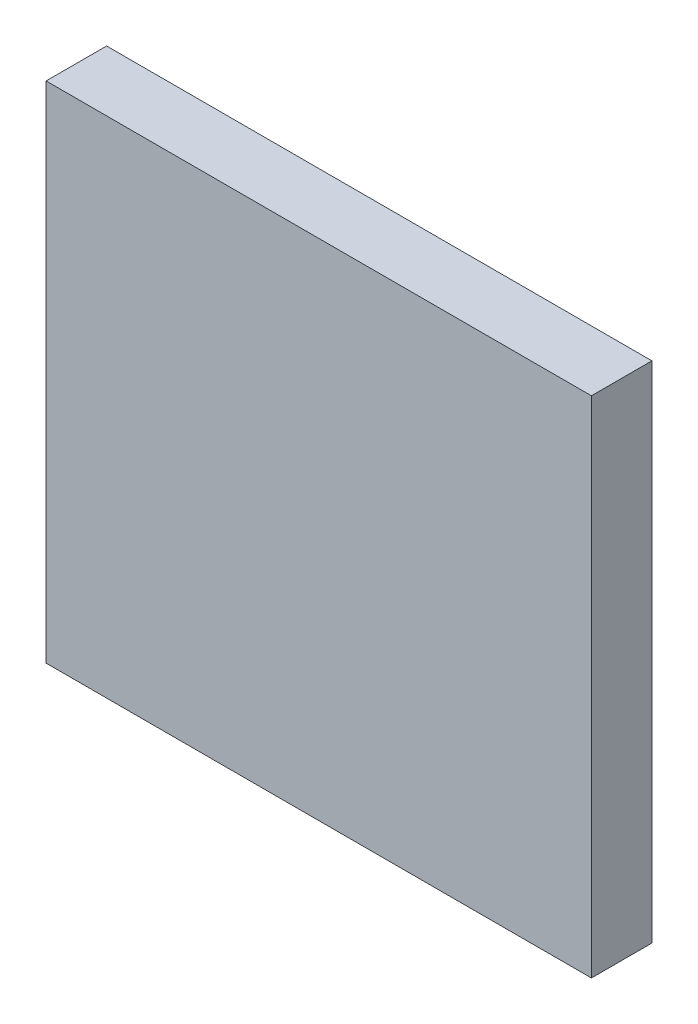
ISO-10303-21;
HEADER;
FILE_DESCRIPTION(('STEP AP214'),'2;1');
FILE_NAME('part.step','',(''),(''),'','','');
FILE_SCHEMA(('AUTOMOTIVE_DESIGN { 1 0 10303 214 1 1 1 1 }'));
ENDSEC;
DATA;
#1=APPLICATION_CONTEXT('core data for automotive mechanical design processes');
#2=APPLICATION_PROTOCOL_DEFINITION('international standard','automotive_design',2000,#1);
#3=PRODUCT_CONTEXT('',#1,'mechanical');
#4=PRODUCT('Part','Part','',(#3));
#5=PRODUCT_RELATED_PRODUCT_CATEGORY('part','',(#4));
#6=PRODUCT_DEFINITION_FORMATION('','',#4);
#7=PRODUCT_DEFINITION_CONTEXT('part definition',#1,'design');
#8=PRODUCT_DEFINITION('design','',#6,#7);
#9=PRODUCT_DEFINITION_SHAPE('','',#8);
#10=(LENGTH_UNIT() NAMED_UNIT(*) SI_UNIT(.MILLI.,.METRE.));
#11=(NAMED_UNIT(*) PLANE_ANGLE_UNIT() SI_UNIT($,.RADIAN.));
#12=(NAMED_UNIT(*) SI_UNIT($,.STERADIAN.) SOLID_ANGLE_UNIT());
#13=UNCERTAINTY_MEASURE_WITH_UNIT(LENGTH_MEASURE(1.E-05),#10,'distance_accuracy_value','');
#14=(GEOMETRIC_REPRESENTATION_CONTEXT(3) GLOBAL_UNCERTAINTY_ASSIGNED_CONTEXT((#13)) GLOBAL_UNIT_ASSIGNED_CONTEXT((#10,
#11,#12)) REPRESENTATION_CONTEXT('',''));
#15=CARTESIAN_POINT('',(0.,0.,0.));
#16=DIRECTION('',(0.,0.,1.));
#17=DIRECTION('',(1.,0.,0.));
#18=AXIS2_PLACEMENT_3D('',#15,#16,#17);
#19=CARTESIAN_POINT('',(45.0599175187588,-41.6654481044949,10.));
#20=DIRECTION('',(-1.,0.,0.));
#21=DIRECTION('',(0.,0.,1.));
#22=AXIS2_PLACEMENT_3D('',#19,#20,#21);
#23=PLANE('',#22);
#24=DIRECTION('',(0.,1.,0.));
#25=VECTOR('',#24,1.);
#26=CARTESIAN_POINT('',(45.0599175187588,-41.6654481044949,0.));
#27=LINE('',#26,#25);
#28=CARTESIAN_POINT('',(45.0599175187588,-41.6654481044949,0.));
#29=VERTEX_POINT('',#28);
#30=CARTESIAN_POINT('',(45.0599175187588,41.6654481044949,0.));
#31=VERTEX_POINT('',#30);
#32=EDGE_CURVE('E111',#29,#31,#27,.T.);
#33=ORIENTED_EDGE('',*,*,#32,.T.);
#34=DIRECTION('',(0.,0.,-1.));
#35=VECTOR('',#34,1.);
#36=CARTESIAN_POINT('',(45.0599175187588,41.6654481044949,10.));
#37=LINE('',#36,#35);
#38=CARTESIAN_POINT('',(45.0599175187588,41.6654481044949,10.));
#39=VERTEX_POINT('',#38);
#40=EDGE_CURVE('E11',#39,#31,#37,.T.);
#41=ORIENTED_EDGE('',*,*,#40,.F.);
#42=DIRECTION('',(0.,1.,0.));
#43=VECTOR('',#42,1.);
#44=CARTESIAN_POINT('',(45.0599175187588,-41.6654481044949,10.));
#45=LINE('',#44,#43);
#46=CARTESIAN_POINT('',(45.0599175187588,-41.6654481044949,10.));
#47=VERTEX_POINT('',#46);
#48=EDGE_CURVE('E95',#47,#39,#45,.T.);
#49=ORIENTED_EDGE('',*,*,#48,.F.);
#50=DIRECTION('',(0.,0.,-1.));
#51=VECTOR('',#50,1.);
#52=CARTESIAN_POINT('',(45.0599175187588,-41.6654481044949,10.));
#53=LINE('',#52,#51);
#54=EDGE_CURVE('E107',#47,#29,#53,.T.);
#55=ORIENTED_EDGE('',*,*,#54,.T.);
#56=EDGE_LOOP('',(#33,#41,#49,#55));
#57=FACE_BOUND('',#56,.T.);
#58=ADVANCED_FACE('F43',(#57),#23,.F.);
#59=CARTESIAN_POINT('',(-45.0599175187588,41.6654481044949,10.));
#60=DIRECTION('',(0.,-1.,0.));
#61=DIRECTION('',(0.,0.,-1.));
#62=AXIS2_PLACEMENT_3D('',#59,#60,#61);
#63=PLANE('',#62);
#64=DIRECTION('',(-1.,0.,0.));
#65=VECTOR('',#64,1.);
#66=CARTESIAN_POINT('',(-45.0599175187588,41.6654481044949,0.));
#67=LINE('',#66,#65);
#68=CARTESIAN_POINT('',(-45.0599175187588,41.6654481044949,0.));
#69=VERTEX_POINT('',#68);
#70=EDGE_CURVE('E100',#31,#69,#67,.T.);
#71=ORIENTED_EDGE('',*,*,#70,.T.);
#72=DIRECTION('',(0.,0.,-1.));
#73=VECTOR('',#72,1.);
#74=CARTESIAN_POINT('',(-45.0599175187588,41.6654481044949,10.));
#75=LINE('',#74,#73);
#76=CARTESIAN_POINT('',(-45.0599175187588,41.6654481044949,10.));
#77=VERTEX_POINT('',#76);
#78=EDGE_CURVE('E52',#77,#69,#75,.T.);
#79=ORIENTED_EDGE('',*,*,#78,.F.);
#80=DIRECTION('',(-1.,0.,0.));
#81=VECTOR('',#80,1.);
#82=CARTESIAN_POINT('',(-45.0599175187588,41.6654481044949,10.));
#83=LINE('',#82,#81);
#84=EDGE_CURVE('E90',#39,#77,#83,.T.);
#85=ORIENTED_EDGE('',*,*,#84,.F.);
#86=ORIENTED_EDGE('',*,*,#40,.T.);
#87=EDGE_LOOP('',(#71,#79,#85,#86));
#88=FACE_BOUND('',#87,.T.);
#89=ADVANCED_FACE('F99',(#88),#63,.F.);
#90=CARTESIAN_POINT('',(-45.0599175187588,-41.6654481044949,10.));
#91=DIRECTION('',(1.,0.,0.));
#92=DIRECTION('',(0.,0.,-1.));
#93=AXIS2_PLACEMENT_3D('',#90,#91,#92);
#94=PLANE('',#93);
#95=DIRECTION('',(0.,-1.,0.));
#96=VECTOR('',#95,1.);
#97=CARTESIAN_POINT('',(-45.0599175187588,-41.6654481044949,0.));
#98=LINE('',#97,#96);
#99=CARTESIAN_POINT('',(-45.0599175187588,-41.6654481044949,0.));
#100=VERTEX_POINT('',#99);
#101=EDGE_CURVE('E77',#69,#100,#98,.T.);
#102=ORIENTED_EDGE('',*,*,#101,.T.);
#103=DIRECTION('',(0.,0.,-1.));
#104=VECTOR('',#103,1.);
#105=CARTESIAN_POINT('',(-45.0599175187588,-41.6654481044949,10.));
#106=LINE('',#105,#104);
#107=CARTESIAN_POINT('',(-45.0599175187588,-41.6654481044949,10.));
#108=VERTEX_POINT('',#107);
#109=EDGE_CURVE('E102',#108,#100,#106,.T.);
#110=ORIENTED_EDGE('',*,*,#109,.F.);
#111=DIRECTION('',(0.,-1.,0.));
#112=VECTOR('',#111,1.);
#113=CARTESIAN_POINT('',(-45.0599175187588,-41.6654481044949,10.));
#114=LINE('',#113,#112);
#115=EDGE_CURVE('E93',#77,#108,#114,.T.);
#116=ORIENTED_EDGE('',*,*,#115,.F.);
#117=ORIENTED_EDGE('',*,*,#78,.T.);
#118=EDGE_LOOP('',(#102,#110,#116,#117));
#119=FACE_BOUND('',#118,.T.);
#120=ADVANCED_FACE('F103',(#119),#94,.F.);
#121=CARTESIAN_POINT('',(-45.0599175187588,-41.6654481044949,10.));
#122=DIRECTION('',(0.,1.,0.));
#123=DIRECTION('',(0.,0.,1.));
#124=AXIS2_PLACEMENT_3D('',#121,#122,#123);
#125=PLANE('',#124);
#126=DIRECTION('',(1.,0.,0.));
#127=VECTOR('',#126,1.);
#128=CARTESIAN_POINT('',(-45.0599175187588,-41.6654481044949,0.));
#129=LINE('',#128,#127);
#130=EDGE_CURVE('E83',#100,#29,#129,.T.);
#131=ORIENTED_EDGE('',*,*,#130,.T.);
#132=ORIENTED_EDGE('',*,*,#54,.F.);
#133=DIRECTION('',(1.,0.,0.));
#134=VECTOR('',#133,1.);
#135=CARTESIAN_POINT('',(-45.0599175187588,-41.6654481044949,10.));
#136=LINE('',#135,#134);
#137=EDGE_CURVE('E60',#108,#47,#136,.T.);
#138=ORIENTED_EDGE('',*,*,#137,.F.);
#139=ORIENTED_EDGE('',*,*,#109,.T.);
#140=EDGE_LOOP('',(#131,#132,#138,#139));
#141=FACE_BOUND('',#140,.T.);
#142=ADVANCED_FACE('F124',(#141),#125,.F.);
#143=CARTESIAN_POINT('',(0.,0.,10.));
#144=DIRECTION('',(0.,0.,-1.));
#145=DIRECTION('',(-1.,0.,0.));
#146=AXIS2_PLACEMENT_3D('',#143,#144,#145);
#147=PLANE('',#146);
#148=ORIENTED_EDGE('',*,*,#48,.T.);
#149=ORIENTED_EDGE('',*,*,#84,.T.);
#150=ORIENTED_EDGE('',*,*,#115,.T.);
#151=ORIENTED_EDGE('',*,*,#137,.T.);
#152=EDGE_LOOP('',(#148,#149,#150,#151));
#153=FACE_BOUND('',#152,.T.);
#154=ADVANCED_FACE('F91',(#153),#147,.F.);
#155=CARTESIAN_POINT('',(0.,0.,0.));
#156=DIRECTION('',(0.,0.,-1.));
#157=DIRECTION('',(-1.,0.,0.));
#158=AXIS2_PLACEMENT_3D('',#155,#156,#157);
#159=PLANE('',#158);
#160=ORIENTED_EDGE('',*,*,#32,.F.);
#161=ORIENTED_EDGE('',*,*,#130,.F.);
#162=ORIENTED_EDGE('',*,*,#101,.F.);
#163=ORIENTED_EDGE('',*,*,#70,.F.);
#164=EDGE_LOOP('',(#160,#161,#162,#163));
#165=FACE_BOUND('',#164,.T.);
#166=ADVANCED_FACE('F127',(#165),#159,.T.);
#167=CLOSED_SHELL('',(#58,#89,#120,#142,#154,#166));
#168=MANIFOLD_SOLID_BREP('B2',#167);
#169=ADVANCED_BREP_SHAPE_REPRESENTATION('',(#18,#168),#14);
#170=SHAPE_DEFINITION_REPRESENTATION(#9,#169);
ENDSEC;
END-ISO-10303-21;
